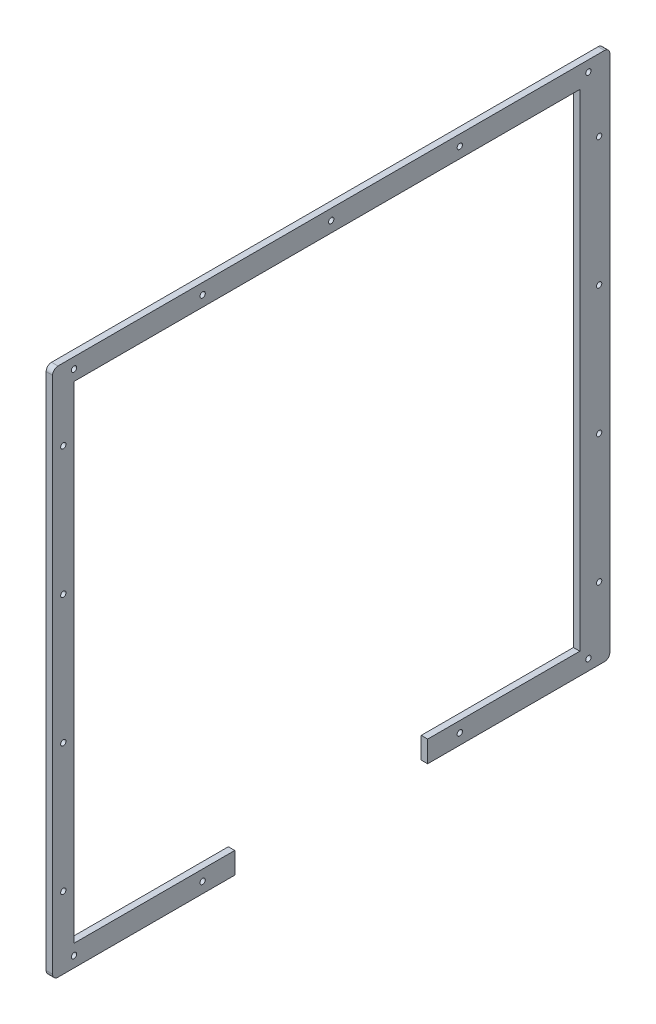
ISO-10303-21;
HEADER;
FILE_DESCRIPTION(('STEP AP214'),'2;1');
FILE_NAME('part.step','',(''),(''),'','','');
FILE_SCHEMA(('AUTOMOTIVE_DESIGN { 1 0 10303 214 1 1 1 1 }'));
ENDSEC;
DATA;
#1=APPLICATION_CONTEXT('core data for automotive mechanical design processes');
#2=APPLICATION_PROTOCOL_DEFINITION('international standard','automotive_design',2000,#1);
#3=PRODUCT_CONTEXT('',#1,'mechanical');
#4=PRODUCT('Part','Part','',(#3));
#5=PRODUCT_RELATED_PRODUCT_CATEGORY('part','',(#4));
#6=PRODUCT_DEFINITION_FORMATION('','',#4);
#7=PRODUCT_DEFINITION_CONTEXT('part definition',#1,'design');
#8=PRODUCT_DEFINITION('design','',#6,#7);
#9=PRODUCT_DEFINITION_SHAPE('','',#8);
#10=(LENGTH_UNIT() NAMED_UNIT(*) SI_UNIT(.MILLI.,.METRE.));
#11=(NAMED_UNIT(*) PLANE_ANGLE_UNIT() SI_UNIT($,.RADIAN.));
#12=(NAMED_UNIT(*) SI_UNIT($,.STERADIAN.) SOLID_ANGLE_UNIT());
#13=UNCERTAINTY_MEASURE_WITH_UNIT(LENGTH_MEASURE(1.E-05),#10,'distance_accuracy_value','');
#14=(GEOMETRIC_REPRESENTATION_CONTEXT(3) GLOBAL_UNCERTAINTY_ASSIGNED_CONTEXT((#13)) GLOBAL_UNIT_ASSIGNED_CONTEXT((#10,
#11,#12)) REPRESENTATION_CONTEXT('',''));
#15=CARTESIAN_POINT('',(0.,0.,0.));
#16=DIRECTION('',(0.,0.,1.));
#17=DIRECTION('',(1.,0.,0.));
#18=AXIS2_PLACEMENT_3D('',#15,#16,#17);
#19=CARTESIAN_POINT('',(1200.,2.22044604925031E-13,-1.11022302462516E-13));
#20=DIRECTION('',(1.,0.,0.));
#21=DIRECTION('',(0.,0.,-1.));
#22=AXIS2_PLACEMENT_3D('',#19,#20,#21);
#23=PLANE('',#22);
#24=CARTESIAN_POINT('',(1200.,-750.,220.));
#25=DIRECTION('',(1.,0.,0.));
#26=DIRECTION('',(0.,0.,-1.));
#27=AXIS2_PLACEMENT_3D('',#24,#25,#26);
#28=CIRCLE('',#27,2.49999999999995);
#29=CARTESIAN_POINT('',(1200.,-750.,217.5));
#30=VERTEX_POINT('',#29);
#31=EDGE_CURVE('E302',#30,#30,#28,.T.);
#32=ORIENTED_EDGE('',*,*,#31,.T.);
#33=EDGE_LOOP('',(#32));
#34=FACE_BOUND('',#33,.T.);
#35=CARTESIAN_POINT('',(1200.,-750.,460.));
#36=DIRECTION('',(1.,0.,0.));
#37=DIRECTION('',(0.,0.,-1.));
#38=AXIS2_PLACEMENT_3D('',#35,#36,#37);
#39=CIRCLE('',#38,2.49999999999995);
#40=CARTESIAN_POINT('',(1200.,-750.,457.5));
#41=VERTEX_POINT('',#40);
#42=EDGE_CURVE('E306',#41,#41,#39,.T.);
#43=ORIENTED_EDGE('',*,*,#42,.T.);
#44=EDGE_LOOP('',(#43));
#45=FACE_BOUND('',#44,.T.);
#46=CARTESIAN_POINT('',(1200.,-750.,580.));
#47=DIRECTION('',(1.,0.,0.));
#48=DIRECTION('',(0.,0.,-1.));
#49=AXIS2_PLACEMENT_3D('',#46,#47,#48);
#50=CIRCLE('',#49,2.49999999999995);
#51=CARTESIAN_POINT('',(1200.,-750.,577.5));
#52=VERTEX_POINT('',#51);
#53=EDGE_CURVE('E309',#52,#52,#50,.T.);
#54=ORIENTED_EDGE('',*,*,#53,.T.);
#55=EDGE_LOOP('',(#54));
#56=FACE_BOUND('',#55,.T.);
#57=CARTESIAN_POINT('',(1200.,-750.,99.9999999999999));
#58=DIRECTION('',(1.,0.,0.));
#59=DIRECTION('',(0.,0.,-1.));
#60=AXIS2_PLACEMENT_3D('',#57,#58,#59);
#61=CIRCLE('',#60,2.49999999999995);
#62=CARTESIAN_POINT('',(1200.,-750.,97.4999999999999));
#63=VERTEX_POINT('',#62);
#64=EDGE_CURVE('E312',#63,#63,#61,.T.);
#65=ORIENTED_EDGE('',*,*,#64,.T.);
#66=EDGE_LOOP('',(#65));
#67=FACE_BOUND('',#66,.T.);
#68=CARTESIAN_POINT('',(1200.,-807.,89.9999999999998));
#69=DIRECTION('',(1.,0.,0.));
#70=DIRECTION('',(0.,0.,-1.));
#71=AXIS2_PLACEMENT_3D('',#68,#69,#70);
#72=CIRCLE('',#71,2.49999999999995);
#73=CARTESIAN_POINT('',(1200.,-807.,87.4999999999999));
#74=VERTEX_POINT('',#73);
#75=EDGE_CURVE('E315',#74,#74,#72,.T.);
#76=ORIENTED_EDGE('',*,*,#75,.T.);
#77=EDGE_LOOP('',(#76));
#78=FACE_BOUND('',#77,.T.);
#79=CARTESIAN_POINT('',(1200.,-927.,89.9999999999999));
#80=DIRECTION('',(1.,0.,0.));
#81=DIRECTION('',(0.,0.,-1.));
#82=AXIS2_PLACEMENT_3D('',#79,#80,#81);
#83=CIRCLE('',#82,2.49999999999995);
#84=CARTESIAN_POINT('',(1200.,-927.,87.4999999999999));
#85=VERTEX_POINT('',#84);
#86=EDGE_CURVE('E318',#85,#85,#83,.T.);
#87=ORIENTED_EDGE('',*,*,#86,.T.);
#88=EDGE_LOOP('',(#87));
#89=FACE_BOUND('',#88,.T.);
#90=CARTESIAN_POINT('',(1200.,-1047.,89.9999999999998));
#91=DIRECTION('',(1.,0.,0.));
#92=DIRECTION('',(0.,0.,-1.));
#93=AXIS2_PLACEMENT_3D('',#90,#91,#92);
#94=CIRCLE('',#93,2.49999999999995);
#95=CARTESIAN_POINT('',(1200.,-1047.,87.4999999999999));
#96=VERTEX_POINT('',#95);
#97=EDGE_CURVE('E321',#96,#96,#94,.T.);
#98=ORIENTED_EDGE('',*,*,#97,.T.);
#99=EDGE_LOOP('',(#98));
#100=FACE_BOUND('',#99,.T.);
#101=CARTESIAN_POINT('',(1200.,-1167.,89.9999999999999));
#102=DIRECTION('',(1.,0.,0.));
#103=DIRECTION('',(0.,0.,-1.));
#104=AXIS2_PLACEMENT_3D('',#101,#102,#103);
#105=CIRCLE('',#104,2.49999999999995);
#106=CARTESIAN_POINT('',(1200.,-1167.,87.4999999999999));
#107=VERTEX_POINT('',#106);
#108=EDGE_CURVE('E324',#107,#107,#105,.T.);
#109=ORIENTED_EDGE('',*,*,#108,.T.);
#110=EDGE_LOOP('',(#109));
#111=FACE_BOUND('',#110,.T.);
#112=CARTESIAN_POINT('',(1200.,-750.,340.));
#113=DIRECTION('',(1.,0.,0.));
#114=DIRECTION('',(0.,0.,-1.));
#115=AXIS2_PLACEMENT_3D('',#112,#113,#114);
#116=CIRCLE('',#115,2.49999999999995);
#117=CARTESIAN_POINT('',(1200.,-750.,337.5));
#118=VERTEX_POINT('',#117);
#119=EDGE_CURVE('E327',#118,#118,#116,.T.);
#120=ORIENTED_EDGE('',*,*,#119,.T.);
#121=EDGE_LOOP('',(#120));
#122=FACE_BOUND('',#121,.T.);
#123=CARTESIAN_POINT('',(1200.,-1224.,99.9999999999999));
#124=DIRECTION('',(1.,0.,0.));
#125=DIRECTION('',(0.,0.,-1.));
#126=AXIS2_PLACEMENT_3D('',#123,#124,#125);
#127=CIRCLE('',#126,2.49999999999995);
#128=CARTESIAN_POINT('',(1200.,-1224.,97.5));
#129=VERTEX_POINT('',#128);
#130=EDGE_CURVE('E330',#129,#129,#127,.T.);
#131=ORIENTED_EDGE('',*,*,#130,.T.);
#132=EDGE_LOOP('',(#131));
#133=FACE_BOUND('',#132,.T.);
#134=CARTESIAN_POINT('',(1200.,-1224.,580.));
#135=DIRECTION('',(1.,0.,0.));
#136=DIRECTION('',(0.,0.,-1.));
#137=AXIS2_PLACEMENT_3D('',#134,#135,#136);
#138=CIRCLE('',#137,2.49999999999995);
#139=CARTESIAN_POINT('',(1200.,-1224.,577.5));
#140=VERTEX_POINT('',#139);
#141=EDGE_CURVE('E333',#140,#140,#138,.T.);
#142=ORIENTED_EDGE('',*,*,#141,.T.);
#143=EDGE_LOOP('',(#142));
#144=FACE_BOUND('',#143,.T.);
#145=CARTESIAN_POINT('',(1200.,-1224.,460.));
#146=DIRECTION('',(1.,0.,0.));
#147=DIRECTION('',(0.,0.,-1.));
#148=AXIS2_PLACEMENT_3D('',#145,#146,#147);
#149=CIRCLE('',#148,2.49999999999995);
#150=CARTESIAN_POINT('',(1200.,-1224.,457.5));
#151=VERTEX_POINT('',#150);
#152=EDGE_CURVE('E336',#151,#151,#149,.T.);
#153=ORIENTED_EDGE('',*,*,#152,.T.);
#154=EDGE_LOOP('',(#153));
#155=FACE_BOUND('',#154,.T.);
#156=CARTESIAN_POINT('',(1200.,-1224.,220.));
#157=DIRECTION('',(1.,0.,0.));
#158=DIRECTION('',(0.,0.,-1.));
#159=AXIS2_PLACEMENT_3D('',#156,#157,#158);
#160=CIRCLE('',#159,2.49999999999995);
#161=CARTESIAN_POINT('',(1200.,-1224.,217.5));
#162=VERTEX_POINT('',#161);
#163=EDGE_CURVE('E339',#162,#162,#160,.T.);
#164=ORIENTED_EDGE('',*,*,#163,.T.);
#165=EDGE_LOOP('',(#164));
#166=FACE_BOUND('',#165,.T.);
#167=CARTESIAN_POINT('',(1200.,-1167.,590.));
#168=DIRECTION('',(1.,0.,0.));
#169=DIRECTION('',(0.,0.,-1.));
#170=AXIS2_PLACEMENT_3D('',#167,#168,#169);
#171=CIRCLE('',#170,2.49999999999995);
#172=CARTESIAN_POINT('',(1200.,-1167.,587.5));
#173=VERTEX_POINT('',#172);
#174=EDGE_CURVE('E342',#173,#173,#171,.T.);
#175=ORIENTED_EDGE('',*,*,#174,.T.);
#176=EDGE_LOOP('',(#175));
#177=FACE_BOUND('',#176,.T.);
#178=CARTESIAN_POINT('',(1200.,-1047.,590.));
#179=DIRECTION('',(1.,0.,0.));
#180=DIRECTION('',(0.,0.,-1.));
#181=AXIS2_PLACEMENT_3D('',#178,#179,#180);
#182=CIRCLE('',#181,2.49999999999995);
#183=CARTESIAN_POINT('',(1200.,-1047.,587.5));
#184=VERTEX_POINT('',#183);
#185=EDGE_CURVE('E345',#184,#184,#182,.T.);
#186=ORIENTED_EDGE('',*,*,#185,.T.);
#187=EDGE_LOOP('',(#186));
#188=FACE_BOUND('',#187,.T.);
#189=CARTESIAN_POINT('',(1200.,-927.,590.));
#190=DIRECTION('',(1.,0.,0.));
#191=DIRECTION('',(0.,0.,-1.));
#192=AXIS2_PLACEMENT_3D('',#189,#190,#191);
#193=CIRCLE('',#192,2.49999999999995);
#194=CARTESIAN_POINT('',(1200.,-927.,587.5));
#195=VERTEX_POINT('',#194);
#196=EDGE_CURVE('E348',#195,#195,#193,.T.);
#197=ORIENTED_EDGE('',*,*,#196,.T.);
#198=EDGE_LOOP('',(#197));
#199=FACE_BOUND('',#198,.T.);
#200=CARTESIAN_POINT('',(1200.,-807.,590.));
#201=DIRECTION('',(1.,0.,0.));
#202=DIRECTION('',(0.,0.,-1.));
#203=AXIS2_PLACEMENT_3D('',#200,#201,#202);
#204=CIRCLE('',#203,2.49999999999995);
#205=CARTESIAN_POINT('',(1200.,-807.,587.5));
#206=VERTEX_POINT('',#205);
#207=EDGE_CURVE('E351',#206,#206,#204,.T.);
#208=ORIENTED_EDGE('',*,*,#207,.T.);
#209=EDGE_LOOP('',(#208));
#210=FACE_BOUND('',#209,.T.);
#211=DIRECTION('',(0.,0.,-1.));
#212=VECTOR('',#211,1.);
#213=CARTESIAN_POINT('',(1200.,-740.,79.9999999999998));
#214=LINE('',#213,#212);
#215=CARTESIAN_POINT('',(1200.,-740.,595.));
#216=VERTEX_POINT('',#215);
#217=CARTESIAN_POINT('',(1200.,-740.,84.9999999999998));
#218=VERTEX_POINT('',#217);
#219=EDGE_CURVE('E380',#216,#218,#214,.T.);
#220=ORIENTED_EDGE('',*,*,#219,.T.);
#221=CARTESIAN_POINT('',(1200.,-745.,84.9999999999998));
#222=DIRECTION('',(-1.,0.,0.));
#223=DIRECTION('',(0.,0.,1.));
#224=AXIS2_PLACEMENT_3D('',#221,#222,#223);
#225=CIRCLE('',#224,5.);
#226=CARTESIAN_POINT('',(1200.,-745.,79.9999999999997));
#227=VERTEX_POINT('',#226);
#228=EDGE_CURVE('E359',#227,#218,#225,.F.);
#229=ORIENTED_EDGE('',*,*,#228,.F.);
#230=DIRECTION('',(0.,-1.,0.));
#231=VECTOR('',#230,1.);
#232=CARTESIAN_POINT('',(1200.,-740.,79.9999999999998));
#233=LINE('',#232,#231);
#234=CARTESIAN_POINT('',(1200.,-1229.,79.9999999999998));
#235=VERTEX_POINT('',#234);
#236=EDGE_CURVE('E225',#227,#235,#233,.T.);
#237=ORIENTED_EDGE('',*,*,#236,.T.);
#238=CARTESIAN_POINT('',(1200.,-1229.,84.9999999999999));
#239=DIRECTION('',(-1.,0.,0.));
#240=DIRECTION('',(0.,0.,1.));
#241=AXIS2_PLACEMENT_3D('',#238,#239,#240);
#242=CIRCLE('',#241,5.);
#243=CARTESIAN_POINT('',(1200.,-1234.,84.9999999999999));
#244=VERTEX_POINT('',#243);
#245=EDGE_CURVE('E175',#244,#235,#242,.F.);
#246=ORIENTED_EDGE('',*,*,#245,.F.);
#247=DIRECTION('',(0.,0.,1.));
#248=VECTOR('',#247,1.);
#249=CARTESIAN_POINT('',(1200.,-1234.,79.9999999999998));
#250=LINE('',#249,#248);
#251=CARTESIAN_POINT('',(1200.,-1234.,250.));
#252=VERTEX_POINT('',#251);
#253=EDGE_CURVE('E176',#244,#252,#250,.T.);
#254=ORIENTED_EDGE('',*,*,#253,.T.);
#255=DIRECTION('',(0.,1.,0.));
#256=VECTOR('',#255,1.);
#257=CARTESIAN_POINT('',(1200.,-1214.,250.));
#258=LINE('',#257,#256);
#259=CARTESIAN_POINT('',(1200.,-1214.,250.));
#260=VERTEX_POINT('',#259);
#261=EDGE_CURVE('E172',#252,#260,#258,.T.);
#262=ORIENTED_EDGE('',*,*,#261,.T.);
#263=DIRECTION('',(0.,0.,-1.));
#264=VECTOR('',#263,1.);
#265=CARTESIAN_POINT('',(1200.,-1214.,108.));
#266=LINE('',#265,#264);
#267=CARTESIAN_POINT('',(1200.,-1214.,108.));
#268=VERTEX_POINT('',#267);
#269=EDGE_CURVE('E202',#260,#268,#266,.T.);
#270=ORIENTED_EDGE('',*,*,#269,.T.);
#271=DIRECTION('',(0.,1.,0.));
#272=VECTOR('',#271,1.);
#273=CARTESIAN_POINT('',(1200.,-760.,108.));
#274=LINE('',#273,#272);
#275=CARTESIAN_POINT('',(1200.,-760.,108.));
#276=VERTEX_POINT('',#275);
#277=EDGE_CURVE('E207',#268,#276,#274,.T.);
#278=ORIENTED_EDGE('',*,*,#277,.T.);
#279=DIRECTION('',(0.,0.,1.));
#280=VECTOR('',#279,1.);
#281=CARTESIAN_POINT('',(1200.,-760.,108.));
#282=LINE('',#281,#280);
#283=CARTESIAN_POINT('',(1200.,-760.,580.));
#284=VERTEX_POINT('',#283);
#285=EDGE_CURVE('E230',#276,#284,#282,.T.);
#286=ORIENTED_EDGE('',*,*,#285,.T.);
#287=DIRECTION('',(0.,-1.,0.));
#288=VECTOR('',#287,1.);
#289=CARTESIAN_POINT('',(1200.,-760.,580.));
#290=LINE('',#289,#288);
#291=CARTESIAN_POINT('',(1200.,-1214.,580.));
#292=VERTEX_POINT('',#291);
#293=EDGE_CURVE('E233',#284,#292,#290,.T.);
#294=ORIENTED_EDGE('',*,*,#293,.T.);
#295=DIRECTION('',(0.,0.,-1.));
#296=VECTOR('',#295,1.);
#297=CARTESIAN_POINT('',(1200.,-1214.,430.));
#298=LINE('',#297,#296);
#299=CARTESIAN_POINT('',(1200.,-1214.,430.));
#300=VERTEX_POINT('',#299);
#301=EDGE_CURVE('E123',#292,#300,#298,.T.);
#302=ORIENTED_EDGE('',*,*,#301,.T.);
#303=DIRECTION('',(0.,-1.,0.));
#304=VECTOR('',#303,1.);
#305=CARTESIAN_POINT('',(1200.,-1214.,430.));
#306=LINE('',#305,#304);
#307=CARTESIAN_POINT('',(1200.,-1234.,430.));
#308=VERTEX_POINT('',#307);
#309=EDGE_CURVE('E119',#300,#308,#306,.T.);
#310=ORIENTED_EDGE('',*,*,#309,.T.);
#311=DIRECTION('',(0.,0.,1.));
#312=VECTOR('',#311,1.);
#313=CARTESIAN_POINT('',(1200.,-1234.,430.));
#314=LINE('',#313,#312);
#315=CARTESIAN_POINT('',(1200.,-1234.,595.));
#316=VERTEX_POINT('',#315);
#317=EDGE_CURVE('E115',#308,#316,#314,.T.);
#318=ORIENTED_EDGE('',*,*,#317,.T.);
#319=CARTESIAN_POINT('',(1200.,-1229.,595.));
#320=DIRECTION('',(-1.,0.,0.));
#321=DIRECTION('',(0.,0.,1.));
#322=AXIS2_PLACEMENT_3D('',#319,#320,#321);
#323=CIRCLE('',#322,5.);
#324=CARTESIAN_POINT('',(1200.,-1229.,600.));
#325=VERTEX_POINT('',#324);
#326=EDGE_CURVE('E46',#325,#316,#323,.F.);
#327=ORIENTED_EDGE('',*,*,#326,.F.);
#328=DIRECTION('',(0.,1.,0.));
#329=VECTOR('',#328,1.);
#330=CARTESIAN_POINT('',(1200.,-740.,600.));
#331=LINE('',#330,#329);
#332=CARTESIAN_POINT('',(1200.,-745.,600.));
#333=VERTEX_POINT('',#332);
#334=EDGE_CURVE('E381',#325,#333,#331,.T.);
#335=ORIENTED_EDGE('',*,*,#334,.T.);
#336=CARTESIAN_POINT('',(1200.,-745.,595.));
#337=DIRECTION('',(-1.,0.,0.));
#338=DIRECTION('',(0.,0.,1.));
#339=AXIS2_PLACEMENT_3D('',#336,#337,#338);
#340=CIRCLE('',#339,5.);
#341=EDGE_CURVE('E354',#216,#333,#340,.F.);
#342=ORIENTED_EDGE('',*,*,#341,.F.);
#343=EDGE_LOOP('',(#220,#229,#237,#246,#254,#262,#270,#278,#286,#294,#302,#310,#318,#327,#335,#342));
#344=FACE_BOUND('',#343,.T.);
#345=ADVANCED_FACE('F43',(#34,#45,#56,#67,#78,#89,#100,#111,#122,#133,#144,#155,#166,#177,#188,
#199,#210,#344),#23,.F.);
#346=CARTESIAN_POINT('',(1206.,-740.,600.));
#347=DIRECTION('',(0.,0.,-1.));
#348=DIRECTION('',(-1.,0.,0.));
#349=AXIS2_PLACEMENT_3D('',#346,#347,#348);
#350=PLANE('',#349);
#351=ORIENTED_EDGE('',*,*,#334,.F.);
#352=DIRECTION('',(-1.,0.,0.));
#353=VECTOR('',#352,1.);
#354=CARTESIAN_POINT('',(1206.,-1229.,600.));
#355=LINE('',#354,#353);
#356=CARTESIAN_POINT('',(1206.,-1229.,600.));
#357=VERTEX_POINT('',#356);
#358=EDGE_CURVE('E240',#357,#325,#355,.T.);
#359=ORIENTED_EDGE('',*,*,#358,.F.);
#360=DIRECTION('',(0.,1.,0.));
#361=VECTOR('',#360,1.);
#362=CARTESIAN_POINT('',(1206.,2.22044604925031E-13,600.));
#363=LINE('',#362,#361);
#364=CARTESIAN_POINT('',(1206.,-745.,600.));
#365=VERTEX_POINT('',#364);
#366=EDGE_CURVE('E301',#365,#357,#363,.F.);
#367=ORIENTED_EDGE('',*,*,#366,.F.);
#368=DIRECTION('',(-1.,0.,0.));
#369=VECTOR('',#368,1.);
#370=CARTESIAN_POINT('',(1206.,-745.,600.));
#371=LINE('',#370,#369);
#372=EDGE_CURVE('E357',#333,#365,#371,.F.);
#373=ORIENTED_EDGE('',*,*,#372,.F.);
#374=EDGE_LOOP('',(#351,#359,#367,#373));
#375=FACE_BOUND('',#374,.T.);
#376=ADVANCED_FACE('F422',(#375),#350,.F.);
#377=CARTESIAN_POINT('',(1206.,-1229.,595.));
#378=DIRECTION('',(-1.,0.,0.));
#379=DIRECTION('',(0.,0.,1.));
#380=AXIS2_PLACEMENT_3D('',#377,#378,#379);
#381=CYLINDRICAL_SURFACE('',#380,5.);
#382=CARTESIAN_POINT('',(1206.,-1229.,595.));
#383=DIRECTION('',(-1.,0.,0.));
#384=DIRECTION('',(0.,0.,1.));
#385=AXIS2_PLACEMENT_3D('',#382,#383,#384);
#386=CIRCLE('',#385,5.);
#387=CARTESIAN_POINT('',(1206.,-1234.,595.));
#388=VERTEX_POINT('',#387);
#389=EDGE_CURVE('E298',#357,#388,#386,.F.);
#390=ORIENTED_EDGE('',*,*,#389,.F.);
#391=ORIENTED_EDGE('',*,*,#358,.T.);
#392=ORIENTED_EDGE('',*,*,#326,.T.);
#393=DIRECTION('',(1.,0.,0.));
#394=VECTOR('',#393,1.);
#395=CARTESIAN_POINT('',(1206.,-1234.,595.));
#396=LINE('',#395,#394);
#397=EDGE_CURVE('E239',#316,#388,#396,.T.);
#398=ORIENTED_EDGE('',*,*,#397,.T.);
#399=EDGE_LOOP('',(#390,#391,#392,#398));
#400=FACE_BOUND('',#399,.T.);
#401=ADVANCED_FACE('F420',(#400),#381,.T.);
#402=CARTESIAN_POINT('',(1206.,-1234.,430.));
#403=DIRECTION('',(0.,1.,0.));
#404=DIRECTION('',(0.,0.,1.));
#405=AXIS2_PLACEMENT_3D('',#402,#403,#404);
#406=PLANE('',#405);
#407=DIRECTION('',(0.,0.,-1.));
#408=VECTOR('',#407,1.);
#409=CARTESIAN_POINT('',(1206.,-1234.,-1.11022302462516E-13));
#410=LINE('',#409,#408);
#411=CARTESIAN_POINT('',(1206.,-1234.,430.));
#412=VERTEX_POINT('',#411);
#413=EDGE_CURVE('E300',#388,#412,#410,.T.);
#414=ORIENTED_EDGE('',*,*,#413,.F.);
#415=ORIENTED_EDGE('',*,*,#397,.F.);
#416=ORIENTED_EDGE('',*,*,#317,.F.);
#417=DIRECTION('',(1.,0.,0.));
#418=VECTOR('',#417,1.);
#419=CARTESIAN_POINT('',(1206.,-1234.,430.));
#420=LINE('',#419,#418);
#421=EDGE_CURVE('E237',#308,#412,#420,.T.);
#422=ORIENTED_EDGE('',*,*,#421,.T.);
#423=EDGE_LOOP('',(#414,#415,#416,#422));
#424=FACE_BOUND('',#423,.T.);
#425=ADVANCED_FACE('F411',(#424),#406,.F.);
#426=CARTESIAN_POINT('',(1206.,-1214.,430.));
#427=DIRECTION('',(0.,0.,1.));
#428=DIRECTION('',(0.,-1.,0.));
#429=AXIS2_PLACEMENT_3D('',#426,#427,#428);
#430=PLANE('',#429);
#431=DIRECTION('',(0.,1.,0.));
#432=VECTOR('',#431,1.);
#433=CARTESIAN_POINT('',(1206.,3.33066907387547E-13,430.));
#434=LINE('',#433,#432);
#435=CARTESIAN_POINT('',(1206.,-1214.,430.));
#436=VERTEX_POINT('',#435);
#437=EDGE_CURVE('E393',#412,#436,#434,.T.);
#438=ORIENTED_EDGE('',*,*,#437,.F.);
#439=ORIENTED_EDGE('',*,*,#421,.F.);
#440=ORIENTED_EDGE('',*,*,#309,.F.);
#441=DIRECTION('',(1.,0.,0.));
#442=VECTOR('',#441,1.);
#443=CARTESIAN_POINT('',(1206.,-1214.,430.));
#444=LINE('',#443,#442);
#445=EDGE_CURVE('E235',#300,#436,#444,.T.);
#446=ORIENTED_EDGE('',*,*,#445,.T.);
#447=EDGE_LOOP('',(#438,#439,#440,#446));
#448=FACE_BOUND('',#447,.T.);
#449=ADVANCED_FACE('F414',(#448),#430,.F.);
#450=CARTESIAN_POINT('',(1206.,-1214.,430.));
#451=DIRECTION('',(0.,-1.,0.));
#452=DIRECTION('',(0.,0.,-1.));
#453=AXIS2_PLACEMENT_3D('',#450,#451,#452);
#454=PLANE('',#453);
#455=DIRECTION('',(0.,0.,-1.));
#456=VECTOR('',#455,1.);
#457=CARTESIAN_POINT('',(1206.,-1214.,-1.11022302462516E-13));
#458=LINE('',#457,#456);
#459=CARTESIAN_POINT('',(1206.,-1214.,580.));
#460=VERTEX_POINT('',#459);
#461=EDGE_CURVE('E405',#436,#460,#458,.F.);
#462=ORIENTED_EDGE('',*,*,#461,.F.);
#463=ORIENTED_EDGE('',*,*,#445,.F.);
#464=ORIENTED_EDGE('',*,*,#301,.F.);
#465=DIRECTION('',(1.,0.,0.));
#466=VECTOR('',#465,1.);
#467=CARTESIAN_POINT('',(1206.,-1214.,580.));
#468=LINE('',#467,#466);
#469=EDGE_CURVE('E232',#292,#460,#468,.T.);
#470=ORIENTED_EDGE('',*,*,#469,.T.);
#471=EDGE_LOOP('',(#462,#463,#464,#470));
#472=FACE_BOUND('',#471,.T.);
#473=ADVANCED_FACE('F639',(#472),#454,.F.);
#474=CARTESIAN_POINT('',(1206.,-760.,580.));
#475=DIRECTION('',(0.,0.,1.));
#476=DIRECTION('',(0.,-1.,0.));
#477=AXIS2_PLACEMENT_3D('',#474,#475,#476);
#478=PLANE('',#477);
#479=DIRECTION('',(0.,1.,0.));
#480=VECTOR('',#479,1.);
#481=CARTESIAN_POINT('',(1206.,3.33066907387547E-13,580.));
#482=LINE('',#481,#480);
#483=CARTESIAN_POINT('',(1206.,-760.,580.));
#484=VERTEX_POINT('',#483);
#485=EDGE_CURVE('E211',#460,#484,#482,.T.);
#486=ORIENTED_EDGE('',*,*,#485,.F.);
#487=ORIENTED_EDGE('',*,*,#469,.F.);
#488=ORIENTED_EDGE('',*,*,#293,.F.);
#489=DIRECTION('',(1.,0.,0.));
#490=VECTOR('',#489,1.);
#491=CARTESIAN_POINT('',(1206.,-760.,580.));
#492=LINE('',#491,#490);
#493=EDGE_CURVE('E212',#284,#484,#492,.T.);
#494=ORIENTED_EDGE('',*,*,#493,.T.);
#495=EDGE_LOOP('',(#486,#487,#488,#494));
#496=FACE_BOUND('',#495,.T.);
#497=ADVANCED_FACE('F648',(#496),#478,.F.);
#498=CARTESIAN_POINT('',(1206.,-760.,108.));
#499=DIRECTION('',(0.,1.,0.));
#500=DIRECTION('',(0.,0.,1.));
#501=AXIS2_PLACEMENT_3D('',#498,#499,#500);
#502=PLANE('',#501);
#503=DIRECTION('',(0.,0.,-1.));
#504=VECTOR('',#503,1.);
#505=CARTESIAN_POINT('',(1206.,-760.,-1.11022302462516E-13));
#506=LINE('',#505,#504);
#507=CARTESIAN_POINT('',(1206.,-760.,108.));
#508=VERTEX_POINT('',#507);
#509=EDGE_CURVE('E204',#484,#508,#506,.T.);
#510=ORIENTED_EDGE('',*,*,#509,.F.);
#511=ORIENTED_EDGE('',*,*,#493,.F.);
#512=ORIENTED_EDGE('',*,*,#285,.F.);
#513=DIRECTION('',(1.,0.,0.));
#514=VECTOR('',#513,1.);
#515=CARTESIAN_POINT('',(1206.,-760.,108.));
#516=LINE('',#515,#514);
#517=EDGE_CURVE('E205',#276,#508,#516,.T.);
#518=ORIENTED_EDGE('',*,*,#517,.T.);
#519=EDGE_LOOP('',(#510,#511,#512,#518));
#520=FACE_BOUND('',#519,.T.);
#521=ADVANCED_FACE('F658',(#520),#502,.F.);
#522=CARTESIAN_POINT('',(1206.,-760.,108.));
#523=DIRECTION('',(0.,0.,-1.));
#524=DIRECTION('',(0.,1.,0.));
#525=AXIS2_PLACEMENT_3D('',#522,#523,#524);
#526=PLANE('',#525);
#527=DIRECTION('',(0.,1.,0.));
#528=VECTOR('',#527,1.);
#529=CARTESIAN_POINT('',(1206.,3.33066907387547E-13,108.));
#530=LINE('',#529,#528);
#531=CARTESIAN_POINT('',(1206.,-1214.,108.));
#532=VERTEX_POINT('',#531);
#533=EDGE_CURVE('E194',#508,#532,#530,.F.);
#534=ORIENTED_EDGE('',*,*,#533,.F.);
#535=ORIENTED_EDGE('',*,*,#517,.F.);
#536=ORIENTED_EDGE('',*,*,#277,.F.);
#537=DIRECTION('',(1.,0.,0.));
#538=VECTOR('',#537,1.);
#539=CARTESIAN_POINT('',(1206.,-1214.,108.));
#540=LINE('',#539,#538);
#541=EDGE_CURVE('E200',#268,#532,#540,.T.);
#542=ORIENTED_EDGE('',*,*,#541,.T.);
#543=EDGE_LOOP('',(#534,#535,#536,#542));
#544=FACE_BOUND('',#543,.T.);
#545=ADVANCED_FACE('F668',(#544),#526,.F.);
#546=CARTESIAN_POINT('',(1206.,-1214.,108.));
#547=DIRECTION('',(0.,-1.,0.));
#548=DIRECTION('',(0.,0.,-1.));
#549=AXIS2_PLACEMENT_3D('',#546,#547,#548);
#550=PLANE('',#549);
#551=DIRECTION('',(0.,0.,-1.));
#552=VECTOR('',#551,1.);
#553=CARTESIAN_POINT('',(1206.,-1214.,-1.11022302462516E-13));
#554=LINE('',#553,#552);
#555=CARTESIAN_POINT('',(1206.,-1214.,250.));
#556=VERTEX_POINT('',#555);
#557=EDGE_CURVE('E192',#532,#556,#554,.F.);
#558=ORIENTED_EDGE('',*,*,#557,.F.);
#559=ORIENTED_EDGE('',*,*,#541,.F.);
#560=ORIENTED_EDGE('',*,*,#269,.F.);
#561=DIRECTION('',(-1.,0.,0.));
#562=VECTOR('',#561,1.);
#563=CARTESIAN_POINT('',(1206.,-1214.,250.));
#564=LINE('',#563,#562);
#565=EDGE_CURVE('E198',#260,#556,#564,.F.);
#566=ORIENTED_EDGE('',*,*,#565,.T.);
#567=EDGE_LOOP('',(#558,#559,#560,#566));
#568=FACE_BOUND('',#567,.T.);
#569=ADVANCED_FACE('F678',(#568),#550,.F.);
#570=CARTESIAN_POINT('',(1206.,-1214.,250.));
#571=DIRECTION('',(0.,0.,-1.));
#572=DIRECTION('',(-1.,0.,0.));
#573=AXIS2_PLACEMENT_3D('',#570,#571,#572);
#574=PLANE('',#573);
#575=DIRECTION('',(0.,1.,0.));
#576=VECTOR('',#575,1.);
#577=CARTESIAN_POINT('',(1206.,3.33066907387547E-13,250.));
#578=LINE('',#577,#576);
#579=CARTESIAN_POINT('',(1206.,-1234.,250.));
#580=VERTEX_POINT('',#579);
#581=EDGE_CURVE('E170',#556,#580,#578,.F.);
#582=ORIENTED_EDGE('',*,*,#581,.F.);
#583=ORIENTED_EDGE('',*,*,#565,.F.);
#584=ORIENTED_EDGE('',*,*,#261,.F.);
#585=DIRECTION('',(1.,0.,0.));
#586=VECTOR('',#585,1.);
#587=CARTESIAN_POINT('',(1206.,-1234.,250.));
#588=LINE('',#587,#586);
#589=EDGE_CURVE('E165',#252,#580,#588,.T.);
#590=ORIENTED_EDGE('',*,*,#589,.T.);
#591=EDGE_LOOP('',(#582,#583,#584,#590));
#592=FACE_BOUND('',#591,.T.);
#593=ADVANCED_FACE('F167',(#592),#574,.F.);
#594=CARTESIAN_POINT('',(1206.,-1234.,79.9999999999998));
#595=DIRECTION('',(0.,1.,0.));
#596=DIRECTION('',(0.,0.,1.));
#597=AXIS2_PLACEMENT_3D('',#594,#595,#596);
#598=PLANE('',#597);
#599=ORIENTED_EDGE('',*,*,#253,.F.);
#600=DIRECTION('',(-1.,0.,0.));
#601=VECTOR('',#600,1.);
#602=CARTESIAN_POINT('',(1206.,-1234.,84.9999999999999));
#603=LINE('',#602,#601);
#604=CARTESIAN_POINT('',(1206.,-1234.,84.9999999999999));
#605=VERTEX_POINT('',#604);
#606=EDGE_CURVE('E182',#605,#244,#603,.T.);
#607=ORIENTED_EDGE('',*,*,#606,.F.);
#608=DIRECTION('',(0.,0.,-1.));
#609=VECTOR('',#608,1.);
#610=CARTESIAN_POINT('',(1206.,-1234.,-1.11022302462516E-13));
#611=LINE('',#610,#609);
#612=EDGE_CURVE('E179',#580,#605,#611,.T.);
#613=ORIENTED_EDGE('',*,*,#612,.F.);
#614=ORIENTED_EDGE('',*,*,#589,.F.);
#615=EDGE_LOOP('',(#599,#607,#613,#614));
#616=FACE_BOUND('',#615,.T.);
#617=ADVANCED_FACE('F180',(#616),#598,.F.);
#618=CARTESIAN_POINT('',(1206.,-1229.,84.9999999999999));
#619=DIRECTION('',(-1.,0.,0.));
#620=DIRECTION('',(0.,0.,1.));
#621=AXIS2_PLACEMENT_3D('',#618,#619,#620);
#622=CYLINDRICAL_SURFACE('',#621,5.);
#623=CARTESIAN_POINT('',(1206.,-1229.,84.9999999999999));
#624=DIRECTION('',(-1.,0.,0.));
#625=DIRECTION('',(0.,0.,1.));
#626=AXIS2_PLACEMENT_3D('',#623,#624,#625);
#627=CIRCLE('',#626,5.);
#628=CARTESIAN_POINT('',(1206.,-1229.,79.9999999999998));
#629=VERTEX_POINT('',#628);
#630=EDGE_CURVE('E186',#605,#629,#627,.F.);
#631=ORIENTED_EDGE('',*,*,#630,.F.);
#632=ORIENTED_EDGE('',*,*,#606,.T.);
#633=ORIENTED_EDGE('',*,*,#245,.T.);
#634=DIRECTION('',(1.,0.,0.));
#635=VECTOR('',#634,1.);
#636=CARTESIAN_POINT('',(1206.,-1229.,79.9999999999998));
#637=LINE('',#636,#635);
#638=EDGE_CURVE('E362',#235,#629,#637,.T.);
#639=ORIENTED_EDGE('',*,*,#638,.T.);
#640=EDGE_LOOP('',(#631,#632,#633,#639));
#641=FACE_BOUND('',#640,.T.);
#642=ADVANCED_FACE('F436',(#641),#622,.T.);
#643=CARTESIAN_POINT('',(1206.,-740.,79.9999999999998));
#644=DIRECTION('',(0.,0.,1.));
#645=DIRECTION('',(0.,-1.,0.));
#646=AXIS2_PLACEMENT_3D('',#643,#644,#645);
#647=PLANE('',#646);
#648=DIRECTION('',(0.,1.,0.));
#649=VECTOR('',#648,1.);
#650=CARTESIAN_POINT('',(1206.,2.22044604925031E-13,79.9999999999998));
#651=LINE('',#650,#649);
#652=CARTESIAN_POINT('',(1206.,-745.,79.9999999999997));
#653=VERTEX_POINT('',#652);
#654=EDGE_CURVE('E296',#629,#653,#651,.T.);
#655=ORIENTED_EDGE('',*,*,#654,.F.);
#656=ORIENTED_EDGE('',*,*,#638,.F.);
#657=ORIENTED_EDGE('',*,*,#236,.F.);
#658=DIRECTION('',(-1.,0.,0.));
#659=VECTOR('',#658,1.);
#660=CARTESIAN_POINT('',(1206.,-745.,79.9999999999997));
#661=LINE('',#660,#659);
#662=EDGE_CURVE('E361',#653,#227,#661,.T.);
#663=ORIENTED_EDGE('',*,*,#662,.F.);
#664=EDGE_LOOP('',(#655,#656,#657,#663));
#665=FACE_BOUND('',#664,.T.);
#666=ADVANCED_FACE('F435',(#665),#647,.F.);
#667=CARTESIAN_POINT('',(1206.,-745.,84.9999999999998));
#668=DIRECTION('',(-1.,0.,0.));
#669=DIRECTION('',(0.,0.,1.));
#670=AXIS2_PLACEMENT_3D('',#667,#668,#669);
#671=CYLINDRICAL_SURFACE('',#670,5.);
#672=CARTESIAN_POINT('',(1206.,-745.,84.9999999999998));
#673=DIRECTION('',(-1.,0.,0.));
#674=DIRECTION('',(0.,0.,1.));
#675=AXIS2_PLACEMENT_3D('',#672,#673,#674);
#676=CIRCLE('',#675,5.);
#677=CARTESIAN_POINT('',(1206.,-740.,84.9999999999998));
#678=VERTEX_POINT('',#677);
#679=EDGE_CURVE('E293',#653,#678,#676,.F.);
#680=ORIENTED_EDGE('',*,*,#679,.F.);
#681=ORIENTED_EDGE('',*,*,#662,.T.);
#682=ORIENTED_EDGE('',*,*,#228,.T.);
#683=DIRECTION('',(1.,0.,0.));
#684=VECTOR('',#683,1.);
#685=CARTESIAN_POINT('',(1206.,-740.,84.9999999999998));
#686=LINE('',#685,#684);
#687=EDGE_CURVE('E358',#218,#678,#686,.T.);
#688=ORIENTED_EDGE('',*,*,#687,.T.);
#689=EDGE_LOOP('',(#680,#681,#682,#688));
#690=FACE_BOUND('',#689,.T.);
#691=ADVANCED_FACE('F432',(#690),#671,.T.);
#692=CARTESIAN_POINT('',(1206.,-740.,79.9999999999998));
#693=DIRECTION('',(0.,-1.,0.));
#694=DIRECTION('',(0.,0.,-1.));
#695=AXIS2_PLACEMENT_3D('',#692,#693,#694);
#696=PLANE('',#695);
#697=DIRECTION('',(0.,0.,-1.));
#698=VECTOR('',#697,1.);
#699=CARTESIAN_POINT('',(1206.,-740.,-1.66533453693773E-13));
#700=LINE('',#699,#698);
#701=CARTESIAN_POINT('',(1206.,-740.,595.));
#702=VERTEX_POINT('',#701);
#703=EDGE_CURVE('E292',#678,#702,#700,.F.);
#704=ORIENTED_EDGE('',*,*,#703,.F.);
#705=ORIENTED_EDGE('',*,*,#687,.F.);
#706=ORIENTED_EDGE('',*,*,#219,.F.);
#707=DIRECTION('',(-1.,0.,0.));
#708=VECTOR('',#707,1.);
#709=CARTESIAN_POINT('',(1206.,-740.,595.));
#710=LINE('',#709,#708);
#711=EDGE_CURVE('E61',#702,#216,#710,.T.);
#712=ORIENTED_EDGE('',*,*,#711,.F.);
#713=EDGE_LOOP('',(#704,#705,#706,#712));
#714=FACE_BOUND('',#713,.T.);
#715=ADVANCED_FACE('F426',(#714),#696,.F.);
#716=CARTESIAN_POINT('',(1206.,-745.,595.));
#717=DIRECTION('',(-1.,0.,0.));
#718=DIRECTION('',(0.,0.,1.));
#719=AXIS2_PLACEMENT_3D('',#716,#717,#718);
#720=CYLINDRICAL_SURFACE('',#719,5.);
#721=CARTESIAN_POINT('',(1206.,-745.,595.));
#722=DIRECTION('',(-1.,0.,0.));
#723=DIRECTION('',(0.,0.,1.));
#724=AXIS2_PLACEMENT_3D('',#721,#722,#723);
#725=CIRCLE('',#724,5.);
#726=EDGE_CURVE('E289',#702,#365,#725,.F.);
#727=ORIENTED_EDGE('',*,*,#726,.F.);
#728=ORIENTED_EDGE('',*,*,#711,.T.);
#729=ORIENTED_EDGE('',*,*,#341,.T.);
#730=ORIENTED_EDGE('',*,*,#372,.T.);
#731=EDGE_LOOP('',(#727,#728,#729,#730));
#732=FACE_BOUND('',#731,.T.);
#733=ADVANCED_FACE('F427',(#732),#720,.T.);
#734=CARTESIAN_POINT('',(1206.,-807.,590.));
#735=DIRECTION('',(1.,0.,0.));
#736=DIRECTION('',(0.,0.,-1.));
#737=AXIS2_PLACEMENT_3D('',#734,#735,#736);
#738=CYLINDRICAL_SURFACE('',#737,2.49999999999995);
#739=ORIENTED_EDGE('',*,*,#207,.F.);
#740=EDGE_LOOP('',(#739));
#741=FACE_BOUND('',#740,.T.);
#742=CARTESIAN_POINT('',(1206.,-807.,590.));
#743=DIRECTION('',(1.,0.,0.));
#744=DIRECTION('',(0.,0.,-1.));
#745=AXIS2_PLACEMENT_3D('',#742,#743,#744);
#746=CIRCLE('',#745,2.49999999999995);
#747=CARTESIAN_POINT('',(1206.,-807.,587.5));
#748=VERTEX_POINT('',#747);
#749=EDGE_CURVE('E286',#748,#748,#746,.F.);
#750=ORIENTED_EDGE('',*,*,#749,.F.);
#751=EDGE_LOOP('',(#750));
#752=FACE_BOUND('',#751,.T.);
#753=ADVANCED_FACE('F515',(#741,#752),#738,.F.);
#754=CARTESIAN_POINT('',(1206.,-927.,590.));
#755=DIRECTION('',(1.,0.,0.));
#756=DIRECTION('',(0.,0.,-1.));
#757=AXIS2_PLACEMENT_3D('',#754,#755,#756);
#758=CYLINDRICAL_SURFACE('',#757,2.49999999999995);
#759=ORIENTED_EDGE('',*,*,#196,.F.);
#760=EDGE_LOOP('',(#759));
#761=FACE_BOUND('',#760,.T.);
#762=CARTESIAN_POINT('',(1206.,-927.,590.));
#763=DIRECTION('',(1.,0.,0.));
#764=DIRECTION('',(0.,0.,-1.));
#765=AXIS2_PLACEMENT_3D('',#762,#763,#764);
#766=CIRCLE('',#765,2.49999999999995);
#767=CARTESIAN_POINT('',(1206.,-927.,587.5));
#768=VERTEX_POINT('',#767);
#769=EDGE_CURVE('E283',#768,#768,#766,.F.);
#770=ORIENTED_EDGE('',*,*,#769,.F.);
#771=EDGE_LOOP('',(#770));
#772=FACE_BOUND('',#771,.T.);
#773=ADVANCED_FACE('F511',(#761,#772),#758,.F.);
#774=CARTESIAN_POINT('',(1206.,-1047.,590.));
#775=DIRECTION('',(1.,0.,0.));
#776=DIRECTION('',(0.,0.,-1.));
#777=AXIS2_PLACEMENT_3D('',#774,#775,#776);
#778=CYLINDRICAL_SURFACE('',#777,2.49999999999995);
#779=ORIENTED_EDGE('',*,*,#185,.F.);
#780=EDGE_LOOP('',(#779));
#781=FACE_BOUND('',#780,.T.);
#782=CARTESIAN_POINT('',(1206.,-1047.,590.));
#783=DIRECTION('',(1.,0.,0.));
#784=DIRECTION('',(0.,0.,-1.));
#785=AXIS2_PLACEMENT_3D('',#782,#783,#784);
#786=CIRCLE('',#785,2.49999999999995);
#787=CARTESIAN_POINT('',(1206.,-1047.,587.5));
#788=VERTEX_POINT('',#787);
#789=EDGE_CURVE('E280',#788,#788,#786,.F.);
#790=ORIENTED_EDGE('',*,*,#789,.F.);
#791=EDGE_LOOP('',(#790));
#792=FACE_BOUND('',#791,.T.);
#793=ADVANCED_FACE('F507',(#781,#792),#778,.F.);
#794=CARTESIAN_POINT('',(1206.,-1167.,590.));
#795=DIRECTION('',(1.,0.,0.));
#796=DIRECTION('',(0.,0.,-1.));
#797=AXIS2_PLACEMENT_3D('',#794,#795,#796);
#798=CYLINDRICAL_SURFACE('',#797,2.49999999999995);
#799=ORIENTED_EDGE('',*,*,#174,.F.);
#800=EDGE_LOOP('',(#799));
#801=FACE_BOUND('',#800,.T.);
#802=CARTESIAN_POINT('',(1206.,-1167.,590.));
#803=DIRECTION('',(1.,0.,0.));
#804=DIRECTION('',(0.,0.,-1.));
#805=AXIS2_PLACEMENT_3D('',#802,#803,#804);
#806=CIRCLE('',#805,2.49999999999995);
#807=CARTESIAN_POINT('',(1206.,-1167.,587.5));
#808=VERTEX_POINT('',#807);
#809=EDGE_CURVE('E277',#808,#808,#806,.F.);
#810=ORIENTED_EDGE('',*,*,#809,.F.);
#811=EDGE_LOOP('',(#810));
#812=FACE_BOUND('',#811,.T.);
#813=ADVANCED_FACE('F503',(#801,#812),#798,.F.);
#814=CARTESIAN_POINT('',(1206.,-1224.,220.));
#815=DIRECTION('',(1.,0.,0.));
#816=DIRECTION('',(0.,0.,-1.));
#817=AXIS2_PLACEMENT_3D('',#814,#815,#816);
#818=CYLINDRICAL_SURFACE('',#817,2.49999999999995);
#819=ORIENTED_EDGE('',*,*,#163,.F.);
#820=EDGE_LOOP('',(#819));
#821=FACE_BOUND('',#820,.T.);
#822=CARTESIAN_POINT('',(1206.,-1224.,220.));
#823=DIRECTION('',(1.,0.,0.));
#824=DIRECTION('',(0.,0.,-1.));
#825=AXIS2_PLACEMENT_3D('',#822,#823,#824);
#826=CIRCLE('',#825,2.49999999999995);
#827=CARTESIAN_POINT('',(1206.,-1224.,217.5));
#828=VERTEX_POINT('',#827);
#829=EDGE_CURVE('E274',#828,#828,#826,.F.);
#830=ORIENTED_EDGE('',*,*,#829,.F.);
#831=EDGE_LOOP('',(#830));
#832=FACE_BOUND('',#831,.T.);
#833=ADVANCED_FACE('F499',(#821,#832),#818,.F.);
#834=CARTESIAN_POINT('',(1206.,-1224.,460.));
#835=DIRECTION('',(1.,0.,0.));
#836=DIRECTION('',(0.,0.,-1.));
#837=AXIS2_PLACEMENT_3D('',#834,#835,#836);
#838=CYLINDRICAL_SURFACE('',#837,2.49999999999995);
#839=ORIENTED_EDGE('',*,*,#152,.F.);
#840=EDGE_LOOP('',(#839));
#841=FACE_BOUND('',#840,.T.);
#842=CARTESIAN_POINT('',(1206.,-1224.,460.));
#843=DIRECTION('',(1.,0.,0.));
#844=DIRECTION('',(0.,0.,-1.));
#845=AXIS2_PLACEMENT_3D('',#842,#843,#844);
#846=CIRCLE('',#845,2.49999999999995);
#847=CARTESIAN_POINT('',(1206.,-1224.,457.5));
#848=VERTEX_POINT('',#847);
#849=EDGE_CURVE('E271',#848,#848,#846,.F.);
#850=ORIENTED_EDGE('',*,*,#849,.F.);
#851=EDGE_LOOP('',(#850));
#852=FACE_BOUND('',#851,.T.);
#853=ADVANCED_FACE('F495',(#841,#852),#838,.F.);
#854=CARTESIAN_POINT('',(1206.,-1224.,580.));
#855=DIRECTION('',(1.,0.,0.));
#856=DIRECTION('',(0.,0.,-1.));
#857=AXIS2_PLACEMENT_3D('',#854,#855,#856);
#858=CYLINDRICAL_SURFACE('',#857,2.49999999999995);
#859=ORIENTED_EDGE('',*,*,#141,.F.);
#860=EDGE_LOOP('',(#859));
#861=FACE_BOUND('',#860,.T.);
#862=CARTESIAN_POINT('',(1206.,-1224.,580.));
#863=DIRECTION('',(1.,0.,0.));
#864=DIRECTION('',(0.,0.,-1.));
#865=AXIS2_PLACEMENT_3D('',#862,#863,#864);
#866=CIRCLE('',#865,2.49999999999995);
#867=CARTESIAN_POINT('',(1206.,-1224.,577.5));
#868=VERTEX_POINT('',#867);
#869=EDGE_CURVE('E268',#868,#868,#866,.F.);
#870=ORIENTED_EDGE('',*,*,#869,.F.);
#871=EDGE_LOOP('',(#870));
#872=FACE_BOUND('',#871,.T.);
#873=ADVANCED_FACE('F491',(#861,#872),#858,.F.);
#874=CARTESIAN_POINT('',(1206.,-1224.,99.9999999999999));
#875=DIRECTION('',(1.,0.,0.));
#876=DIRECTION('',(0.,0.,-1.));
#877=AXIS2_PLACEMENT_3D('',#874,#875,#876);
#878=CYLINDRICAL_SURFACE('',#877,2.49999999999995);
#879=ORIENTED_EDGE('',*,*,#130,.F.);
#880=EDGE_LOOP('',(#879));
#881=FACE_BOUND('',#880,.T.);
#882=CARTESIAN_POINT('',(1206.,-1224.,99.9999999999999));
#883=DIRECTION('',(1.,0.,0.));
#884=DIRECTION('',(0.,0.,-1.));
#885=AXIS2_PLACEMENT_3D('',#882,#883,#884);
#886=CIRCLE('',#885,2.49999999999995);
#887=CARTESIAN_POINT('',(1206.,-1224.,97.5));
#888=VERTEX_POINT('',#887);
#889=EDGE_CURVE('E265',#888,#888,#886,.F.);
#890=ORIENTED_EDGE('',*,*,#889,.F.);
#891=EDGE_LOOP('',(#890));
#892=FACE_BOUND('',#891,.T.);
#893=ADVANCED_FACE('F487',(#881,#892),#878,.F.);
#894=CARTESIAN_POINT('',(1206.,-750.,340.));
#895=DIRECTION('',(1.,0.,0.));
#896=DIRECTION('',(0.,0.,-1.));
#897=AXIS2_PLACEMENT_3D('',#894,#895,#896);
#898=CYLINDRICAL_SURFACE('',#897,2.49999999999995);
#899=ORIENTED_EDGE('',*,*,#119,.F.);
#900=EDGE_LOOP('',(#899));
#901=FACE_BOUND('',#900,.T.);
#902=CARTESIAN_POINT('',(1206.,-750.,340.));
#903=DIRECTION('',(1.,0.,0.));
#904=DIRECTION('',(0.,0.,-1.));
#905=AXIS2_PLACEMENT_3D('',#902,#903,#904);
#906=CIRCLE('',#905,2.49999999999995);
#907=CARTESIAN_POINT('',(1206.,-750.,337.5));
#908=VERTEX_POINT('',#907);
#909=EDGE_CURVE('E262',#908,#908,#906,.F.);
#910=ORIENTED_EDGE('',*,*,#909,.F.);
#911=EDGE_LOOP('',(#910));
#912=FACE_BOUND('',#911,.T.);
#913=ADVANCED_FACE('F483',(#901,#912),#898,.F.);
#914=CARTESIAN_POINT('',(1206.,-1167.,89.9999999999999));
#915=DIRECTION('',(1.,0.,0.));
#916=DIRECTION('',(0.,0.,-1.));
#917=AXIS2_PLACEMENT_3D('',#914,#915,#916);
#918=CYLINDRICAL_SURFACE('',#917,2.49999999999995);
#919=ORIENTED_EDGE('',*,*,#108,.F.);
#920=EDGE_LOOP('',(#919));
#921=FACE_BOUND('',#920,.T.);
#922=CARTESIAN_POINT('',(1206.,-1167.,89.9999999999999));
#923=DIRECTION('',(1.,0.,0.));
#924=DIRECTION('',(0.,0.,-1.));
#925=AXIS2_PLACEMENT_3D('',#922,#923,#924);
#926=CIRCLE('',#925,2.49999999999995);
#927=CARTESIAN_POINT('',(1206.,-1167.,87.4999999999999));
#928=VERTEX_POINT('',#927);
#929=EDGE_CURVE('E259',#928,#928,#926,.F.);
#930=ORIENTED_EDGE('',*,*,#929,.F.);
#931=EDGE_LOOP('',(#930));
#932=FACE_BOUND('',#931,.T.);
#933=ADVANCED_FACE('F479',(#921,#932),#918,.F.);
#934=CARTESIAN_POINT('',(1206.,-1047.,89.9999999999998));
#935=DIRECTION('',(1.,0.,0.));
#936=DIRECTION('',(0.,0.,-1.));
#937=AXIS2_PLACEMENT_3D('',#934,#935,#936);
#938=CYLINDRICAL_SURFACE('',#937,2.49999999999995);
#939=ORIENTED_EDGE('',*,*,#97,.F.);
#940=EDGE_LOOP('',(#939));
#941=FACE_BOUND('',#940,.T.);
#942=CARTESIAN_POINT('',(1206.,-1047.,89.9999999999998));
#943=DIRECTION('',(1.,0.,0.));
#944=DIRECTION('',(0.,0.,-1.));
#945=AXIS2_PLACEMENT_3D('',#942,#943,#944);
#946=CIRCLE('',#945,2.49999999999995);
#947=CARTESIAN_POINT('',(1206.,-1047.,87.4999999999999));
#948=VERTEX_POINT('',#947);
#949=EDGE_CURVE('E256',#948,#948,#946,.F.);
#950=ORIENTED_EDGE('',*,*,#949,.F.);
#951=EDGE_LOOP('',(#950));
#952=FACE_BOUND('',#951,.T.);
#953=ADVANCED_FACE('F475',(#941,#952),#938,.F.);
#954=CARTESIAN_POINT('',(1206.,-927.,89.9999999999999));
#955=DIRECTION('',(1.,0.,0.));
#956=DIRECTION('',(0.,0.,-1.));
#957=AXIS2_PLACEMENT_3D('',#954,#955,#956);
#958=CYLINDRICAL_SURFACE('',#957,2.49999999999995);
#959=ORIENTED_EDGE('',*,*,#86,.F.);
#960=EDGE_LOOP('',(#959));
#961=FACE_BOUND('',#960,.T.);
#962=CARTESIAN_POINT('',(1206.,-927.,89.9999999999999));
#963=DIRECTION('',(1.,0.,0.));
#964=DIRECTION('',(0.,0.,-1.));
#965=AXIS2_PLACEMENT_3D('',#962,#963,#964);
#966=CIRCLE('',#965,2.49999999999995);
#967=CARTESIAN_POINT('',(1206.,-927.,87.4999999999999));
#968=VERTEX_POINT('',#967);
#969=EDGE_CURVE('E253',#968,#968,#966,.F.);
#970=ORIENTED_EDGE('',*,*,#969,.F.);
#971=EDGE_LOOP('',(#970));
#972=FACE_BOUND('',#971,.T.);
#973=ADVANCED_FACE('F471',(#961,#972),#958,.F.);
#974=CARTESIAN_POINT('',(1206.,-807.,89.9999999999998));
#975=DIRECTION('',(1.,0.,0.));
#976=DIRECTION('',(0.,0.,-1.));
#977=AXIS2_PLACEMENT_3D('',#974,#975,#976);
#978=CYLINDRICAL_SURFACE('',#977,2.49999999999995);
#979=ORIENTED_EDGE('',*,*,#75,.F.);
#980=EDGE_LOOP('',(#979));
#981=FACE_BOUND('',#980,.T.);
#982=CARTESIAN_POINT('',(1206.,-807.,89.9999999999998));
#983=DIRECTION('',(1.,0.,0.));
#984=DIRECTION('',(0.,0.,-1.));
#985=AXIS2_PLACEMENT_3D('',#982,#983,#984);
#986=CIRCLE('',#985,2.49999999999995);
#987=CARTESIAN_POINT('',(1206.,-807.,87.4999999999999));
#988=VERTEX_POINT('',#987);
#989=EDGE_CURVE('E250',#988,#988,#986,.F.);
#990=ORIENTED_EDGE('',*,*,#989,.F.);
#991=EDGE_LOOP('',(#990));
#992=FACE_BOUND('',#991,.T.);
#993=ADVANCED_FACE('F467',(#981,#992),#978,.F.);
#994=CARTESIAN_POINT('',(1206.,-750.,99.9999999999999));
#995=DIRECTION('',(1.,0.,0.));
#996=DIRECTION('',(0.,0.,-1.));
#997=AXIS2_PLACEMENT_3D('',#994,#995,#996);
#998=CYLINDRICAL_SURFACE('',#997,2.49999999999995);
#999=ORIENTED_EDGE('',*,*,#64,.F.);
#1000=EDGE_LOOP('',(#999));
#1001=FACE_BOUND('',#1000,.T.);
#1002=CARTESIAN_POINT('',(1206.,-750.,99.9999999999999));
#1003=DIRECTION('',(1.,0.,0.));
#1004=DIRECTION('',(0.,0.,-1.));
#1005=AXIS2_PLACEMENT_3D('',#1002,#1003,#1004);
#1006=CIRCLE('',#1005,2.49999999999995);
#1007=CARTESIAN_POINT('',(1206.,-750.,97.4999999999999));
#1008=VERTEX_POINT('',#1007);
#1009=EDGE_CURVE('E247',#1008,#1008,#1006,.F.);
#1010=ORIENTED_EDGE('',*,*,#1009,.F.);
#1011=EDGE_LOOP('',(#1010));
#1012=FACE_BOUND('',#1011,.T.);
#1013=ADVANCED_FACE('F463',(#1001,#1012),#998,.F.);
#1014=CARTESIAN_POINT('',(1206.,-750.,580.));
#1015=DIRECTION('',(1.,0.,0.));
#1016=DIRECTION('',(0.,0.,-1.));
#1017=AXIS2_PLACEMENT_3D('',#1014,#1015,#1016);
#1018=CYLINDRICAL_SURFACE('',#1017,2.49999999999995);
#1019=ORIENTED_EDGE('',*,*,#53,.F.);
#1020=EDGE_LOOP('',(#1019));
#1021=FACE_BOUND('',#1020,.T.);
#1022=CARTESIAN_POINT('',(1206.,-750.,580.));
#1023=DIRECTION('',(1.,0.,0.));
#1024=DIRECTION('',(0.,0.,-1.));
#1025=AXIS2_PLACEMENT_3D('',#1022,#1023,#1024);
#1026=CIRCLE('',#1025,2.49999999999995);
#1027=CARTESIAN_POINT('',(1206.,-750.,577.5));
#1028=VERTEX_POINT('',#1027);
#1029=EDGE_CURVE('E244',#1028,#1028,#1026,.F.);
#1030=ORIENTED_EDGE('',*,*,#1029,.F.);
#1031=EDGE_LOOP('',(#1030));
#1032=FACE_BOUND('',#1031,.T.);
#1033=ADVANCED_FACE('F459',(#1021,#1032),#1018,.F.);
#1034=CARTESIAN_POINT('',(1206.,-750.,460.));
#1035=DIRECTION('',(1.,0.,0.));
#1036=DIRECTION('',(0.,0.,-1.));
#1037=AXIS2_PLACEMENT_3D('',#1034,#1035,#1036);
#1038=CYLINDRICAL_SURFACE('',#1037,2.49999999999995);
#1039=ORIENTED_EDGE('',*,*,#42,.F.);
#1040=EDGE_LOOP('',(#1039));
#1041=FACE_BOUND('',#1040,.T.);
#1042=CARTESIAN_POINT('',(1206.,-750.,460.));
#1043=DIRECTION('',(1.,0.,0.));
#1044=DIRECTION('',(0.,0.,-1.));
#1045=AXIS2_PLACEMENT_3D('',#1042,#1043,#1044);
#1046=CIRCLE('',#1045,2.49999999999995);
#1047=CARTESIAN_POINT('',(1206.,-750.,457.5));
#1048=VERTEX_POINT('',#1047);
#1049=EDGE_CURVE('E52',#1048,#1048,#1046,.F.);
#1050=ORIENTED_EDGE('',*,*,#1049,.F.);
#1051=EDGE_LOOP('',(#1050));
#1052=FACE_BOUND('',#1051,.T.);
#1053=ADVANCED_FACE('F452',(#1041,#1052),#1038,.F.);
#1054=CARTESIAN_POINT('',(1206.,-750.,220.));
#1055=DIRECTION('',(1.,0.,0.));
#1056=DIRECTION('',(0.,0.,-1.));
#1057=AXIS2_PLACEMENT_3D('',#1054,#1055,#1056);
#1058=CYLINDRICAL_SURFACE('',#1057,2.49999999999995);
#1059=ORIENTED_EDGE('',*,*,#31,.F.);
#1060=EDGE_LOOP('',(#1059));
#1061=FACE_BOUND('',#1060,.T.);
#1062=CARTESIAN_POINT('',(1206.,-750.,220.));
#1063=DIRECTION('',(1.,0.,0.));
#1064=DIRECTION('',(0.,0.,-1.));
#1065=AXIS2_PLACEMENT_3D('',#1062,#1063,#1064);
#1066=CIRCLE('',#1065,2.49999999999995);
#1067=CARTESIAN_POINT('',(1206.,-750.,217.5));
#1068=VERTEX_POINT('',#1067);
#1069=EDGE_CURVE('E12',#1068,#1068,#1066,.F.);
#1070=ORIENTED_EDGE('',*,*,#1069,.F.);
#1071=EDGE_LOOP('',(#1070));
#1072=FACE_BOUND('',#1071,.T.);
#1073=ADVANCED_FACE('F446',(#1061,#1072),#1058,.F.);
#1074=CARTESIAN_POINT('',(1206.,2.22044604925031E-13,-1.11022302462516E-13));
#1075=DIRECTION('',(1.,0.,0.));
#1076=DIRECTION('',(0.,0.,-1.));
#1077=AXIS2_PLACEMENT_3D('',#1074,#1075,#1076);
#1078=PLANE('',#1077);
#1079=ORIENTED_EDGE('',*,*,#1069,.T.);
#1080=EDGE_LOOP('',(#1079));
#1081=FACE_BOUND('',#1080,.T.);
#1082=ORIENTED_EDGE('',*,*,#1049,.T.);
#1083=EDGE_LOOP('',(#1082));
#1084=FACE_BOUND('',#1083,.T.);
#1085=ORIENTED_EDGE('',*,*,#1029,.T.);
#1086=EDGE_LOOP('',(#1085));
#1087=FACE_BOUND('',#1086,.T.);
#1088=ORIENTED_EDGE('',*,*,#1009,.T.);
#1089=EDGE_LOOP('',(#1088));
#1090=FACE_BOUND('',#1089,.T.);
#1091=ORIENTED_EDGE('',*,*,#989,.T.);
#1092=EDGE_LOOP('',(#1091));
#1093=FACE_BOUND('',#1092,.T.);
#1094=ORIENTED_EDGE('',*,*,#969,.T.);
#1095=EDGE_LOOP('',(#1094));
#1096=FACE_BOUND('',#1095,.T.);
#1097=ORIENTED_EDGE('',*,*,#949,.T.);
#1098=EDGE_LOOP('',(#1097));
#1099=FACE_BOUND('',#1098,.T.);
#1100=ORIENTED_EDGE('',*,*,#929,.T.);
#1101=EDGE_LOOP('',(#1100));
#1102=FACE_BOUND('',#1101,.T.);
#1103=ORIENTED_EDGE('',*,*,#909,.T.);
#1104=EDGE_LOOP('',(#1103));
#1105=FACE_BOUND('',#1104,.T.);
#1106=ORIENTED_EDGE('',*,*,#889,.T.);
#1107=EDGE_LOOP('',(#1106));
#1108=FACE_BOUND('',#1107,.T.);
#1109=ORIENTED_EDGE('',*,*,#869,.T.);
#1110=EDGE_LOOP('',(#1109));
#1111=FACE_BOUND('',#1110,.T.);
#1112=ORIENTED_EDGE('',*,*,#849,.T.);
#1113=EDGE_LOOP('',(#1112));
#1114=FACE_BOUND('',#1113,.T.);
#1115=ORIENTED_EDGE('',*,*,#829,.T.);
#1116=EDGE_LOOP('',(#1115));
#1117=FACE_BOUND('',#1116,.T.);
#1118=ORIENTED_EDGE('',*,*,#809,.T.);
#1119=EDGE_LOOP('',(#1118));
#1120=FACE_BOUND('',#1119,.T.);
#1121=ORIENTED_EDGE('',*,*,#789,.T.);
#1122=EDGE_LOOP('',(#1121));
#1123=FACE_BOUND('',#1122,.T.);
#1124=ORIENTED_EDGE('',*,*,#769,.T.);
#1125=EDGE_LOOP('',(#1124));
#1126=FACE_BOUND('',#1125,.T.);
#1127=ORIENTED_EDGE('',*,*,#749,.T.);
#1128=EDGE_LOOP('',(#1127));
#1129=FACE_BOUND('',#1128,.T.);
#1130=ORIENTED_EDGE('',*,*,#703,.T.);
#1131=ORIENTED_EDGE('',*,*,#726,.T.);
#1132=ORIENTED_EDGE('',*,*,#366,.T.);
#1133=ORIENTED_EDGE('',*,*,#389,.T.);
#1134=ORIENTED_EDGE('',*,*,#413,.T.);
#1135=ORIENTED_EDGE('',*,*,#437,.T.);
#1136=ORIENTED_EDGE('',*,*,#461,.T.);
#1137=ORIENTED_EDGE('',*,*,#485,.T.);
#1138=ORIENTED_EDGE('',*,*,#509,.T.);
#1139=ORIENTED_EDGE('',*,*,#533,.T.);
#1140=ORIENTED_EDGE('',*,*,#557,.T.);
#1141=ORIENTED_EDGE('',*,*,#581,.T.);
#1142=ORIENTED_EDGE('',*,*,#612,.T.);
#1143=ORIENTED_EDGE('',*,*,#630,.T.);
#1144=ORIENTED_EDGE('',*,*,#654,.T.);
#1145=ORIENTED_EDGE('',*,*,#679,.T.);
#1146=EDGE_LOOP('',(#1130,#1131,#1132,#1133,#1134,#1135,#1136,#1137,#1138,#1139,#1140,#1141,
#1142,#1143,#1144,#1145));
#1147=FACE_BOUND('',#1146,.T.);
#1148=ADVANCED_FACE('F189',(#1081,#1084,#1087,#1090,#1093,#1096,#1099,#1102,#1105,#1108,#1111,
#1114,#1117,#1120,#1123,#1126,#1129,#1147),#1078,.T.);
#1149=CLOSED_SHELL('',(#345,#376,#401,#425,#449,#473,#497,#521,#545,#569,#593,#617,#642,#666,
#691,#715,#733,#753,#773,#793,#813,#833,#853,#873,#893,#913,#933,#953,#973,#993,#1013,#1033,
#1053,#1073,#1148));
#1150=MANIFOLD_SOLID_BREP('B2',#1149);
#1151=ADVANCED_BREP_SHAPE_REPRESENTATION('',(#18,#1150),#14);
#1152=SHAPE_DEFINITION_REPRESENTATION(#9,#1151);
ENDSEC;
END-ISO-10303-21;
